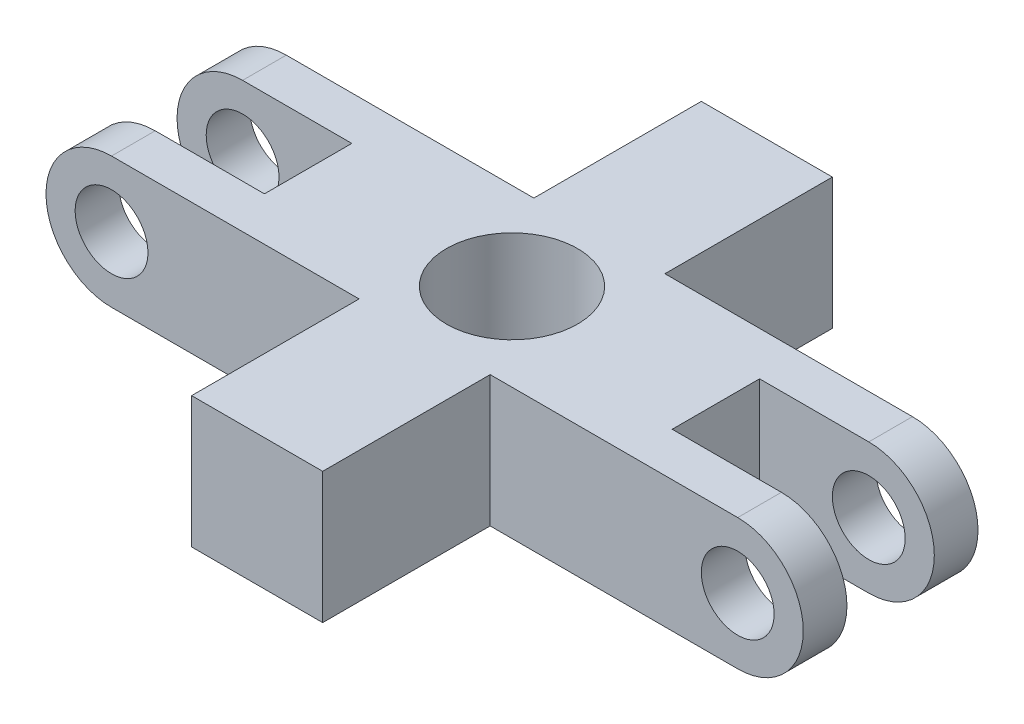
ISO-10303-21;
HEADER;
FILE_DESCRIPTION(('STEP AP214'),'2;1');
FILE_NAME('part.step','',(''),(''),'','','');
FILE_SCHEMA(('AUTOMOTIVE_DESIGN { 1 0 10303 214 1 1 1 1 }'));
ENDSEC;
DATA;
#1=APPLICATION_CONTEXT('core data for automotive mechanical design processes');
#2=APPLICATION_PROTOCOL_DEFINITION('international standard','automotive_design',2000,#1);
#3=PRODUCT_CONTEXT('',#1,'mechanical');
#4=PRODUCT('Part','Part','',(#3));
#5=PRODUCT_RELATED_PRODUCT_CATEGORY('part','',(#4));
#6=PRODUCT_DEFINITION_FORMATION('','',#4);
#7=PRODUCT_DEFINITION_CONTEXT('part definition',#1,'design');
#8=PRODUCT_DEFINITION('design','',#6,#7);
#9=PRODUCT_DEFINITION_SHAPE('','',#8);
#10=(LENGTH_UNIT() NAMED_UNIT(*) SI_UNIT(.MILLI.,.METRE.));
#11=(NAMED_UNIT(*) PLANE_ANGLE_UNIT() SI_UNIT($,.RADIAN.));
#12=(NAMED_UNIT(*) SI_UNIT($,.STERADIAN.) SOLID_ANGLE_UNIT());
#13=UNCERTAINTY_MEASURE_WITH_UNIT(LENGTH_MEASURE(1.E-05),#10,'distance_accuracy_value','');
#14=(GEOMETRIC_REPRESENTATION_CONTEXT(3) GLOBAL_UNCERTAINTY_ASSIGNED_CONTEXT((#13)) GLOBAL_UNIT_ASSIGNED_CONTEXT((#10,
#11,#12)) REPRESENTATION_CONTEXT('',''));
#15=CARTESIAN_POINT('',(0.,0.,0.));
#16=DIRECTION('',(0.,0.,1.));
#17=DIRECTION('',(1.,0.,0.));
#18=AXIS2_PLACEMENT_3D('',#15,#16,#17);
#19=CARTESIAN_POINT('',(21.5,0.,6.00000000000001));
#20=DIRECTION('',(0.,0.,-1.));
#21=DIRECTION('',(-1.,0.,0.));
#22=AXIS2_PLACEMENT_3D('',#19,#20,#21);
#23=CYLINDRICAL_SURFACE('',#22,4.5);
#24=DIRECTION('',(0.,0.,-1.));
#25=VECTOR('',#24,1.);
#26=CARTESIAN_POINT('',(21.5,4.5,0.));
#27=LINE('',#26,#25);
#28=CARTESIAN_POINT('',(21.5,4.5,6.00000000000001));
#29=VERTEX_POINT('',#28);
#30=CARTESIAN_POINT('',(21.5,4.5,3.));
#31=VERTEX_POINT('',#30);
#32=EDGE_CURVE('E189',#29,#31,#27,.T.);
#33=ORIENTED_EDGE('',*,*,#32,.F.);
#34=CARTESIAN_POINT('',(21.5,0.,6.00000000000001));
#35=DIRECTION('',(0.,0.,-1.));
#36=DIRECTION('',(-1.,0.,0.));
#37=AXIS2_PLACEMENT_3D('',#34,#35,#36);
#38=CIRCLE('',#37,4.5);
#39=CARTESIAN_POINT('',(21.5,-4.5,6.00000000000001));
#40=VERTEX_POINT('',#39);
#41=EDGE_CURVE('E54',#40,#29,#38,.F.);
#42=ORIENTED_EDGE('',*,*,#41,.F.);
#43=DIRECTION('',(0.,0.,1.));
#44=VECTOR('',#43,1.);
#45=CARTESIAN_POINT('',(21.5,-4.5,6.00000000000001));
#46=LINE('',#45,#44);
#47=CARTESIAN_POINT('',(21.5,-4.5,3.));
#48=VERTEX_POINT('',#47);
#49=EDGE_CURVE('E389',#48,#40,#46,.T.);
#50=ORIENTED_EDGE('',*,*,#49,.F.);
#51=CARTESIAN_POINT('',(21.5,0.,3.));
#52=DIRECTION('',(0.,0.,1.));
#53=DIRECTION('',(1.,0.,0.));
#54=AXIS2_PLACEMENT_3D('',#51,#52,#53);
#55=CIRCLE('',#54,4.5);
#56=EDGE_CURVE('E11',#31,#48,#55,.F.);
#57=ORIENTED_EDGE('',*,*,#56,.F.);
#58=EDGE_LOOP('',(#33,#42,#50,#57));
#59=FACE_BOUND('',#58,.T.);
#60=ADVANCED_FACE('F44',(#59),#23,.T.);
#61=CARTESIAN_POINT('',(21.5,0.,-3.));
#62=DIRECTION('',(0.,0.,-1.));
#63=DIRECTION('',(-1.,0.,0.));
#64=AXIS2_PLACEMENT_3D('',#61,#62,#63);
#65=CYLINDRICAL_SURFACE('',#64,4.5);
#66=DIRECTION('',(0.,0.,-1.));
#67=VECTOR('',#66,1.);
#68=CARTESIAN_POINT('',(21.5,4.5,0.));
#69=LINE('',#68,#67);
#70=CARTESIAN_POINT('',(21.5,4.5,-3.));
#71=VERTEX_POINT('',#70);
#72=CARTESIAN_POINT('',(21.5,4.5,-5.99999999999999));
#73=VERTEX_POINT('',#72);
#74=EDGE_CURVE('E373',#71,#73,#69,.T.);
#75=ORIENTED_EDGE('',*,*,#74,.F.);
#76=CARTESIAN_POINT('',(21.5,0.,-3.));
#77=DIRECTION('',(0.,0.,-1.));
#78=DIRECTION('',(-1.,0.,0.));
#79=AXIS2_PLACEMENT_3D('',#76,#77,#78);
#80=CIRCLE('',#79,4.5);
#81=CARTESIAN_POINT('',(21.5,-4.5,-3.));
#82=VERTEX_POINT('',#81);
#83=EDGE_CURVE('E381',#82,#71,#80,.F.);
#84=ORIENTED_EDGE('',*,*,#83,.F.);
#85=DIRECTION('',(0.,0.,1.));
#86=VECTOR('',#85,1.);
#87=CARTESIAN_POINT('',(21.5,-4.5,-3.));
#88=LINE('',#87,#86);
#89=CARTESIAN_POINT('',(21.5,-4.5,-5.99999999999999));
#90=VERTEX_POINT('',#89);
#91=EDGE_CURVE('E377',#90,#82,#88,.T.);
#92=ORIENTED_EDGE('',*,*,#91,.F.);
#93=CARTESIAN_POINT('',(21.5,0.,-5.99999999999999));
#94=DIRECTION('',(0.,0.,1.));
#95=DIRECTION('',(1.,0.,0.));
#96=AXIS2_PLACEMENT_3D('',#93,#94,#95);
#97=CIRCLE('',#96,4.5);
#98=EDGE_CURVE('E384',#73,#90,#97,.F.);
#99=ORIENTED_EDGE('',*,*,#98,.F.);
#100=EDGE_LOOP('',(#75,#84,#92,#99));
#101=FACE_BOUND('',#100,.T.);
#102=ADVANCED_FACE('F510',(#101),#65,.T.);
#103=CARTESIAN_POINT('',(-21.5,0.,-5.99999999999999));
#104=DIRECTION('',(0.,0.,1.));
#105=DIRECTION('',(1.,0.,0.));
#106=AXIS2_PLACEMENT_3D('',#103,#104,#105);
#107=CYLINDRICAL_SURFACE('',#106,4.5);
#108=DIRECTION('',(0.,0.,1.));
#109=VECTOR('',#108,1.);
#110=CARTESIAN_POINT('',(-21.5,4.5,0.));
#111=LINE('',#110,#109);
#112=CARTESIAN_POINT('',(-21.5,4.5,-5.99999999999999));
#113=VERTEX_POINT('',#112);
#114=CARTESIAN_POINT('',(-21.5,4.5,-3.));
#115=VERTEX_POINT('',#114);
#116=EDGE_CURVE('E359',#113,#115,#111,.T.);
#117=ORIENTED_EDGE('',*,*,#116,.F.);
#118=CARTESIAN_POINT('',(-21.5,0.,-5.99999999999999));
#119=DIRECTION('',(0.,0.,1.));
#120=DIRECTION('',(1.,0.,0.));
#121=AXIS2_PLACEMENT_3D('',#118,#119,#120);
#122=CIRCLE('',#121,4.5);
#123=CARTESIAN_POINT('',(-21.5,-4.5,-5.99999999999999));
#124=VERTEX_POINT('',#123);
#125=EDGE_CURVE('E367',#124,#113,#122,.F.);
#126=ORIENTED_EDGE('',*,*,#125,.F.);
#127=DIRECTION('',(0.,0.,-1.));
#128=VECTOR('',#127,1.);
#129=CARTESIAN_POINT('',(-21.5,-4.5,-5.99999999999999));
#130=LINE('',#129,#128);
#131=CARTESIAN_POINT('',(-21.5,-4.5,-3.));
#132=VERTEX_POINT('',#131);
#133=EDGE_CURVE('E363',#132,#124,#130,.T.);
#134=ORIENTED_EDGE('',*,*,#133,.F.);
#135=CARTESIAN_POINT('',(-21.5,0.,-3.));
#136=DIRECTION('',(0.,0.,-1.));
#137=DIRECTION('',(-1.,0.,0.));
#138=AXIS2_PLACEMENT_3D('',#135,#136,#137);
#139=CIRCLE('',#138,4.5);
#140=EDGE_CURVE('E370',#115,#132,#139,.F.);
#141=ORIENTED_EDGE('',*,*,#140,.F.);
#142=EDGE_LOOP('',(#117,#126,#134,#141));
#143=FACE_BOUND('',#142,.T.);
#144=ADVANCED_FACE('F508',(#143),#107,.T.);
#145=CARTESIAN_POINT('',(-21.5,0.,3.));
#146=DIRECTION('',(0.,0.,1.));
#147=DIRECTION('',(1.,0.,0.));
#148=AXIS2_PLACEMENT_3D('',#145,#146,#147);
#149=CYLINDRICAL_SURFACE('',#148,4.5);
#150=DIRECTION('',(0.,0.,1.));
#151=VECTOR('',#150,1.);
#152=CARTESIAN_POINT('',(-21.5,4.5,0.));
#153=LINE('',#152,#151);
#154=CARTESIAN_POINT('',(-21.5,4.5,3.));
#155=VERTEX_POINT('',#154);
#156=CARTESIAN_POINT('',(-21.5,4.5,6.));
#157=VERTEX_POINT('',#156);
#158=EDGE_CURVE('E201',#155,#157,#153,.T.);
#159=ORIENTED_EDGE('',*,*,#158,.F.);
#160=CARTESIAN_POINT('',(-21.5,0.,3.));
#161=DIRECTION('',(0.,0.,1.));
#162=DIRECTION('',(1.,0.,0.));
#163=AXIS2_PLACEMENT_3D('',#160,#161,#162);
#164=CIRCLE('',#163,4.5);
#165=CARTESIAN_POINT('',(-21.5,-4.5,3.));
#166=VERTEX_POINT('',#165);
#167=EDGE_CURVE('E353',#166,#155,#164,.F.);
#168=ORIENTED_EDGE('',*,*,#167,.F.);
#169=DIRECTION('',(0.,0.,-1.));
#170=VECTOR('',#169,1.);
#171=CARTESIAN_POINT('',(-21.5,-4.5,3.));
#172=LINE('',#171,#170);
#173=CARTESIAN_POINT('',(-21.5,-4.5,6.));
#174=VERTEX_POINT('',#173);
#175=EDGE_CURVE('E349',#174,#166,#172,.T.);
#176=ORIENTED_EDGE('',*,*,#175,.F.);
#177=CARTESIAN_POINT('',(-21.5,0.,6.));
#178=DIRECTION('',(0.,0.,-1.));
#179=DIRECTION('',(-1.,0.,0.));
#180=AXIS2_PLACEMENT_3D('',#177,#178,#179);
#181=CIRCLE('',#180,4.5);
#182=EDGE_CURVE('E356',#157,#174,#181,.F.);
#183=ORIENTED_EDGE('',*,*,#182,.F.);
#184=EDGE_LOOP('',(#159,#168,#176,#183));
#185=FACE_BOUND('',#184,.T.);
#186=ADVANCED_FACE('F490',(#185),#149,.T.);
#187=CARTESIAN_POINT('',(0.,4.5,0.));
#188=DIRECTION('',(0.,-1.,0.));
#189=DIRECTION('',(0.,0.,-1.));
#190=AXIS2_PLACEMENT_3D('',#187,#188,#189);
#191=PLANE('',#190);
#192=DIRECTION('',(1.,0.,0.));
#193=VECTOR('',#192,1.);
#194=CARTESIAN_POINT('',(4.50000000000001,4.5,6.));
#195=LINE('',#194,#193);
#196=CARTESIAN_POINT('',(4.50000000000001,4.5,6.));
#197=VERTEX_POINT('',#196);
#198=EDGE_CURVE('E191',#197,#29,#195,.T.);
#199=ORIENTED_EDGE('',*,*,#198,.T.);
#200=ORIENTED_EDGE('',*,*,#32,.T.);
#201=DIRECTION('',(-1.,0.,0.));
#202=VECTOR('',#201,1.);
#203=CARTESIAN_POINT('',(14.,4.5,3.));
#204=LINE('',#203,#202);
#205=CARTESIAN_POINT('',(14.,4.5,3.));
#206=VERTEX_POINT('',#205);
#207=EDGE_CURVE('E180',#31,#206,#204,.T.);
#208=ORIENTED_EDGE('',*,*,#207,.T.);
#209=DIRECTION('',(0.,0.,-1.));
#210=VECTOR('',#209,1.);
#211=CARTESIAN_POINT('',(14.,4.5,-3.));
#212=LINE('',#211,#210);
#213=CARTESIAN_POINT('',(14.,4.5,-3.));
#214=VERTEX_POINT('',#213);
#215=EDGE_CURVE('E187',#206,#214,#212,.T.);
#216=ORIENTED_EDGE('',*,*,#215,.T.);
#217=DIRECTION('',(1.,0.,0.));
#218=VECTOR('',#217,1.);
#219=CARTESIAN_POINT('',(26.,4.5,-3.));
#220=LINE('',#219,#218);
#221=EDGE_CURVE('E208',#214,#71,#220,.T.);
#222=ORIENTED_EDGE('',*,*,#221,.T.);
#223=ORIENTED_EDGE('',*,*,#74,.T.);
#224=DIRECTION('',(-1.,0.,0.));
#225=VECTOR('',#224,1.);
#226=CARTESIAN_POINT('',(4.5,4.5,-5.99999999999999));
#227=LINE('',#226,#225);
#228=CARTESIAN_POINT('',(4.5,4.5,-5.99999999999999));
#229=VERTEX_POINT('',#228);
#230=EDGE_CURVE('E211',#73,#229,#227,.T.);
#231=ORIENTED_EDGE('',*,*,#230,.T.);
#232=DIRECTION('',(0.,0.,-1.));
#233=VECTOR('',#232,1.);
#234=CARTESIAN_POINT('',(4.5,4.5,-17.5));
#235=LINE('',#234,#233);
#236=CARTESIAN_POINT('',(4.5,4.5,-17.5));
#237=VERTEX_POINT('',#236);
#238=EDGE_CURVE('E217',#229,#237,#235,.T.);
#239=ORIENTED_EDGE('',*,*,#238,.T.);
#240=DIRECTION('',(-1.,0.,0.));
#241=VECTOR('',#240,1.);
#242=CARTESIAN_POINT('',(-4.5,4.5,-17.5));
#243=LINE('',#242,#241);
#244=CARTESIAN_POINT('',(-4.5,4.5,-17.5));
#245=VERTEX_POINT('',#244);
#246=EDGE_CURVE('E220',#237,#245,#243,.T.);
#247=ORIENTED_EDGE('',*,*,#246,.T.);
#248=DIRECTION('',(0.,0.,1.));
#249=VECTOR('',#248,1.);
#250=CARTESIAN_POINT('',(-4.5,4.5,-17.5));
#251=LINE('',#250,#249);
#252=CARTESIAN_POINT('',(-4.5,4.5,-5.99999999999999));
#253=VERTEX_POINT('',#252);
#254=EDGE_CURVE('E223',#245,#253,#251,.T.);
#255=ORIENTED_EDGE('',*,*,#254,.T.);
#256=DIRECTION('',(-1.,0.,0.));
#257=VECTOR('',#256,1.);
#258=CARTESIAN_POINT('',(-26.,4.5,-5.99999999999999));
#259=LINE('',#258,#257);
#260=EDGE_CURVE('E226',#253,#113,#259,.T.);
#261=ORIENTED_EDGE('',*,*,#260,.T.);
#262=ORIENTED_EDGE('',*,*,#116,.T.);
#263=DIRECTION('',(1.,0.,0.));
#264=VECTOR('',#263,1.);
#265=CARTESIAN_POINT('',(-26.,4.5,-3.));
#266=LINE('',#265,#264);
#267=CARTESIAN_POINT('',(-14.,4.5,-3.));
#268=VERTEX_POINT('',#267);
#269=EDGE_CURVE('E230',#115,#268,#266,.T.);
#270=ORIENTED_EDGE('',*,*,#269,.T.);
#271=DIRECTION('',(0.,0.,1.));
#272=VECTOR('',#271,1.);
#273=CARTESIAN_POINT('',(-14.,4.5,-3.));
#274=LINE('',#273,#272);
#275=CARTESIAN_POINT('',(-14.,4.5,3.));
#276=VERTEX_POINT('',#275);
#277=EDGE_CURVE('E233',#268,#276,#274,.T.);
#278=ORIENTED_EDGE('',*,*,#277,.T.);
#279=DIRECTION('',(-1.,0.,0.));
#280=VECTOR('',#279,1.);
#281=CARTESIAN_POINT('',(-14.,4.5,3.));
#282=LINE('',#281,#280);
#283=EDGE_CURVE('E236',#276,#155,#282,.T.);
#284=ORIENTED_EDGE('',*,*,#283,.T.);
#285=ORIENTED_EDGE('',*,*,#158,.T.);
#286=DIRECTION('',(1.,0.,0.));
#287=VECTOR('',#286,1.);
#288=CARTESIAN_POINT('',(-26.,4.5,6.));
#289=LINE('',#288,#287);
#290=CARTESIAN_POINT('',(-4.5,4.5,6.));
#291=VERTEX_POINT('',#290);
#292=EDGE_CURVE('E240',#157,#291,#289,.T.);
#293=ORIENTED_EDGE('',*,*,#292,.T.);
#294=DIRECTION('',(0.,0.,1.));
#295=VECTOR('',#294,1.);
#296=CARTESIAN_POINT('',(-4.5,4.5,6.));
#297=LINE('',#296,#295);
#298=CARTESIAN_POINT('',(-4.5,4.5,17.5));
#299=VERTEX_POINT('',#298);
#300=EDGE_CURVE('E243',#291,#299,#297,.T.);
#301=ORIENTED_EDGE('',*,*,#300,.T.);
#302=DIRECTION('',(1.,0.,0.));
#303=VECTOR('',#302,1.);
#304=CARTESIAN_POINT('',(-4.5,4.5,17.5));
#305=LINE('',#304,#303);
#306=CARTESIAN_POINT('',(4.5,4.5,17.5));
#307=VERTEX_POINT('',#306);
#308=EDGE_CURVE('E246',#299,#307,#305,.T.);
#309=ORIENTED_EDGE('',*,*,#308,.T.);
#310=DIRECTION('',(0.,0.,-1.));
#311=VECTOR('',#310,1.);
#312=CARTESIAN_POINT('',(4.50000000000001,4.5,6.));
#313=LINE('',#312,#311);
#314=EDGE_CURVE('E249',#307,#197,#313,.T.);
#315=ORIENTED_EDGE('',*,*,#314,.T.);
#316=EDGE_LOOP('',(#199,#200,#208,#216,#222,#223,#231,#239,#247,#255,#261,#262,#270,#278,#284,
#285,#293,#301,#309,#315));
#317=FACE_BOUND('',#316,.T.);
#318=CARTESIAN_POINT('',(0.,4.5,0.));
#319=DIRECTION('',(0.,1.,0.));
#320=DIRECTION('',(0.,0.,1.));
#321=AXIS2_PLACEMENT_3D('',#318,#319,#320);
#322=CIRCLE('',#321,4.5);
#323=CARTESIAN_POINT('',(0.,4.5,4.5));
#324=VERTEX_POINT('',#323);
#325=EDGE_CURVE('E257',#324,#324,#322,.T.);
#326=ORIENTED_EDGE('',*,*,#325,.F.);
#327=EDGE_LOOP('',(#326));
#328=FACE_BOUND('',#327,.T.);
#329=ADVANCED_FACE('F183',(#317,#328),#191,.F.);
#330=CARTESIAN_POINT('',(0.,-4.5,0.));
#331=DIRECTION('',(0.,-1.,0.));
#332=DIRECTION('',(0.,0.,-1.));
#333=AXIS2_PLACEMENT_3D('',#330,#331,#332);
#334=PLANE('',#333);
#335=DIRECTION('',(-1.,0.,0.));
#336=VECTOR('',#335,1.);
#337=CARTESIAN_POINT('',(14.,-4.5,3.));
#338=LINE('',#337,#336);
#339=CARTESIAN_POINT('',(14.,-4.5,3.));
#340=VERTEX_POINT('',#339);
#341=EDGE_CURVE('E197',#48,#340,#338,.T.);
#342=ORIENTED_EDGE('',*,*,#341,.F.);
#343=ORIENTED_EDGE('',*,*,#49,.T.);
#344=DIRECTION('',(1.,0.,0.));
#345=VECTOR('',#344,1.);
#346=CARTESIAN_POINT('',(4.50000000000001,-4.5,6.));
#347=LINE('',#346,#345);
#348=CARTESIAN_POINT('',(4.50000000000001,-4.5,6.));
#349=VERTEX_POINT('',#348);
#350=EDGE_CURVE('E253',#349,#40,#347,.T.);
#351=ORIENTED_EDGE('',*,*,#350,.F.);
#352=DIRECTION('',(0.,0.,-1.));
#353=VECTOR('',#352,1.);
#354=CARTESIAN_POINT('',(4.50000000000001,-4.5,6.));
#355=LINE('',#354,#353);
#356=CARTESIAN_POINT('',(4.5,-4.5,17.5));
#357=VERTEX_POINT('',#356);
#358=EDGE_CURVE('E302',#357,#349,#355,.T.);
#359=ORIENTED_EDGE('',*,*,#358,.F.);
#360=DIRECTION('',(1.,0.,0.));
#361=VECTOR('',#360,1.);
#362=CARTESIAN_POINT('',(-4.5,-4.5,17.5));
#363=LINE('',#362,#361);
#364=CARTESIAN_POINT('',(-4.5,-4.5,17.5));
#365=VERTEX_POINT('',#364);
#366=EDGE_CURVE('E299',#365,#357,#363,.T.);
#367=ORIENTED_EDGE('',*,*,#366,.F.);
#368=DIRECTION('',(0.,0.,1.));
#369=VECTOR('',#368,1.);
#370=CARTESIAN_POINT('',(-4.5,-4.5,6.));
#371=LINE('',#370,#369);
#372=CARTESIAN_POINT('',(-4.5,-4.5,6.));
#373=VERTEX_POINT('',#372);
#374=EDGE_CURVE('E296',#373,#365,#371,.T.);
#375=ORIENTED_EDGE('',*,*,#374,.F.);
#376=DIRECTION('',(1.,0.,0.));
#377=VECTOR('',#376,1.);
#378=CARTESIAN_POINT('',(-26.,-4.5,6.));
#379=LINE('',#378,#377);
#380=EDGE_CURVE('E293',#174,#373,#379,.T.);
#381=ORIENTED_EDGE('',*,*,#380,.F.);
#382=ORIENTED_EDGE('',*,*,#175,.T.);
#383=DIRECTION('',(-1.,0.,0.));
#384=VECTOR('',#383,1.);
#385=CARTESIAN_POINT('',(-14.,-4.5,3.));
#386=LINE('',#385,#384);
#387=CARTESIAN_POINT('',(-14.,-4.5,3.));
#388=VERTEX_POINT('',#387);
#389=EDGE_CURVE('E289',#388,#166,#386,.T.);
#390=ORIENTED_EDGE('',*,*,#389,.F.);
#391=DIRECTION('',(0.,0.,1.));
#392=VECTOR('',#391,1.);
#393=CARTESIAN_POINT('',(-14.,-4.5,-3.));
#394=LINE('',#393,#392);
#395=CARTESIAN_POINT('',(-14.,-4.5,-3.));
#396=VERTEX_POINT('',#395);
#397=EDGE_CURVE('E286',#396,#388,#394,.T.);
#398=ORIENTED_EDGE('',*,*,#397,.F.);
#399=DIRECTION('',(1.,0.,0.));
#400=VECTOR('',#399,1.);
#401=CARTESIAN_POINT('',(-26.,-4.5,-3.));
#402=LINE('',#401,#400);
#403=EDGE_CURVE('E283',#132,#396,#402,.T.);
#404=ORIENTED_EDGE('',*,*,#403,.F.);
#405=ORIENTED_EDGE('',*,*,#133,.T.);
#406=DIRECTION('',(-1.,0.,0.));
#407=VECTOR('',#406,1.);
#408=CARTESIAN_POINT('',(-26.,-4.5,-5.99999999999999));
#409=LINE('',#408,#407);
#410=CARTESIAN_POINT('',(-4.5,-4.5,-5.99999999999999));
#411=VERTEX_POINT('',#410);
#412=EDGE_CURVE('E279',#411,#124,#409,.T.);
#413=ORIENTED_EDGE('',*,*,#412,.F.);
#414=DIRECTION('',(0.,0.,1.));
#415=VECTOR('',#414,1.);
#416=CARTESIAN_POINT('',(-4.5,-4.5,-17.5));
#417=LINE('',#416,#415);
#418=CARTESIAN_POINT('',(-4.5,-4.5,-17.5));
#419=VERTEX_POINT('',#418);
#420=EDGE_CURVE('E276',#419,#411,#417,.T.);
#421=ORIENTED_EDGE('',*,*,#420,.F.);
#422=DIRECTION('',(-1.,0.,0.));
#423=VECTOR('',#422,1.);
#424=CARTESIAN_POINT('',(-4.5,-4.5,-17.5));
#425=LINE('',#424,#423);
#426=CARTESIAN_POINT('',(4.5,-4.5,-17.5));
#427=VERTEX_POINT('',#426);
#428=EDGE_CURVE('E273',#427,#419,#425,.T.);
#429=ORIENTED_EDGE('',*,*,#428,.F.);
#430=DIRECTION('',(0.,0.,-1.));
#431=VECTOR('',#430,1.);
#432=CARTESIAN_POINT('',(4.5,-4.5,-17.5));
#433=LINE('',#432,#431);
#434=CARTESIAN_POINT('',(4.5,-4.5,-5.99999999999999));
#435=VERTEX_POINT('',#434);
#436=EDGE_CURVE('E270',#435,#427,#433,.T.);
#437=ORIENTED_EDGE('',*,*,#436,.F.);
#438=DIRECTION('',(-1.,0.,0.));
#439=VECTOR('',#438,1.);
#440=CARTESIAN_POINT('',(4.5,-4.5,-5.99999999999999));
#441=LINE('',#440,#439);
#442=EDGE_CURVE('E267',#90,#435,#441,.T.);
#443=ORIENTED_EDGE('',*,*,#442,.F.);
#444=ORIENTED_EDGE('',*,*,#91,.T.);
#445=DIRECTION('',(1.,0.,0.));
#446=VECTOR('',#445,1.);
#447=CARTESIAN_POINT('',(26.,-4.5,-3.));
#448=LINE('',#447,#446);
#449=CARTESIAN_POINT('',(14.,-4.5,-3.));
#450=VERTEX_POINT('',#449);
#451=EDGE_CURVE('E263',#450,#82,#448,.T.);
#452=ORIENTED_EDGE('',*,*,#451,.F.);
#453=DIRECTION('',(0.,0.,-1.));
#454=VECTOR('',#453,1.);
#455=CARTESIAN_POINT('',(14.,-4.5,-3.));
#456=LINE('',#455,#454);
#457=EDGE_CURVE('E260',#340,#450,#456,.T.);
#458=ORIENTED_EDGE('',*,*,#457,.F.);
#459=EDGE_LOOP('',(#342,#343,#351,#359,#367,#375,#381,#382,#390,#398,#404,#405,#413,#421,#429,
#437,#443,#444,#452,#458));
#460=FACE_BOUND('',#459,.T.);
#461=CARTESIAN_POINT('',(0.,-4.5,0.));
#462=DIRECTION('',(0.,1.,0.));
#463=DIRECTION('',(0.,0.,1.));
#464=AXIS2_PLACEMENT_3D('',#461,#462,#463);
#465=CIRCLE('',#464,4.5);
#466=CARTESIAN_POINT('',(0.,-4.5,4.5));
#467=VERTEX_POINT('',#466);
#468=EDGE_CURVE('E423',#467,#467,#465,.T.);
#469=ORIENTED_EDGE('',*,*,#468,.T.);
#470=EDGE_LOOP('',(#469));
#471=FACE_BOUND('',#470,.T.);
#472=ADVANCED_FACE('F437',(#460,#471),#334,.T.);
#473=CARTESIAN_POINT('',(4.50000000000001,4.5,6.));
#474=DIRECTION('',(0.,0.,-1.));
#475=DIRECTION('',(-1.,0.,0.));
#476=AXIS2_PLACEMENT_3D('',#473,#474,#475);
#477=PLANE('',#476);
#478=CARTESIAN_POINT('',(21.5,0.,6.00000000000001));
#479=DIRECTION('',(0.,0.,-1.));
#480=DIRECTION('',(-1.,0.,0.));
#481=AXIS2_PLACEMENT_3D('',#478,#479,#480);
#482=CIRCLE('',#481,2.5);
#483=CARTESIAN_POINT('',(19.,0.,6.00000000000001));
#484=VERTEX_POINT('',#483);
#485=EDGE_CURVE('E397',#484,#484,#482,.T.);
#486=ORIENTED_EDGE('',*,*,#485,.T.);
#487=EDGE_LOOP('',(#486));
#488=FACE_BOUND('',#487,.T.);
#489=ORIENTED_EDGE('',*,*,#350,.T.);
#490=ORIENTED_EDGE('',*,*,#41,.T.);
#491=ORIENTED_EDGE('',*,*,#198,.F.);
#492=DIRECTION('',(0.,-1.,0.));
#493=VECTOR('',#492,1.);
#494=CARTESIAN_POINT('',(4.50000000000001,4.5,6.));
#495=LINE('',#494,#493);
#496=EDGE_CURVE('E252',#197,#349,#495,.T.);
#497=ORIENTED_EDGE('',*,*,#496,.T.);
#498=EDGE_LOOP('',(#489,#490,#491,#497));
#499=FACE_BOUND('',#498,.T.);
#500=ADVANCED_FACE('F434',(#488,#499),#477,.F.);
#501=CARTESIAN_POINT('',(14.,4.5,3.));
#502=DIRECTION('',(0.,0.,1.));
#503=DIRECTION('',(1.,0.,0.));
#504=AXIS2_PLACEMENT_3D('',#501,#502,#503);
#505=PLANE('',#504);
#506=CARTESIAN_POINT('',(21.5,0.,3.));
#507=DIRECTION('',(0.,0.,1.));
#508=DIRECTION('',(1.,0.,0.));
#509=AXIS2_PLACEMENT_3D('',#506,#507,#508);
#510=CIRCLE('',#509,2.5);
#511=CARTESIAN_POINT('',(24.,0.,3.));
#512=VERTEX_POINT('',#511);
#513=EDGE_CURVE('E406',#512,#512,#510,.T.);
#514=ORIENTED_EDGE('',*,*,#513,.T.);
#515=EDGE_LOOP('',(#514));
#516=FACE_BOUND('',#515,.T.);
#517=ORIENTED_EDGE('',*,*,#207,.F.);
#518=ORIENTED_EDGE('',*,*,#56,.T.);
#519=ORIENTED_EDGE('',*,*,#341,.T.);
#520=DIRECTION('',(0.,-1.,0.));
#521=VECTOR('',#520,1.);
#522=CARTESIAN_POINT('',(14.,4.5,3.));
#523=LINE('',#522,#521);
#524=EDGE_CURVE('E194',#206,#340,#523,.T.);
#525=ORIENTED_EDGE('',*,*,#524,.F.);
#526=EDGE_LOOP('',(#517,#518,#519,#525));
#527=FACE_BOUND('',#526,.T.);
#528=ADVANCED_FACE('F195',(#516,#527),#505,.F.);
#529=CARTESIAN_POINT('',(14.,4.5,-3.));
#530=DIRECTION('',(-1.,0.,0.));
#531=DIRECTION('',(0.,0.,1.));
#532=AXIS2_PLACEMENT_3D('',#529,#530,#531);
#533=PLANE('',#532);
#534=ORIENTED_EDGE('',*,*,#457,.T.);
#535=DIRECTION('',(0.,-1.,0.));
#536=VECTOR('',#535,1.);
#537=CARTESIAN_POINT('',(14.,4.5,-3.));
#538=LINE('',#537,#536);
#539=EDGE_CURVE('E202',#214,#450,#538,.T.);
#540=ORIENTED_EDGE('',*,*,#539,.F.);
#541=ORIENTED_EDGE('',*,*,#215,.F.);
#542=ORIENTED_EDGE('',*,*,#524,.T.);
#543=EDGE_LOOP('',(#534,#540,#541,#542));
#544=FACE_BOUND('',#543,.T.);
#545=ADVANCED_FACE('F204',(#544),#533,.F.);
#546=CARTESIAN_POINT('',(26.,4.5,-3.));
#547=DIRECTION('',(0.,0.,-1.));
#548=DIRECTION('',(-1.,0.,0.));
#549=AXIS2_PLACEMENT_3D('',#546,#547,#548);
#550=PLANE('',#549);
#551=CARTESIAN_POINT('',(21.5,0.,-3.));
#552=DIRECTION('',(0.,0.,-1.));
#553=DIRECTION('',(-1.,0.,0.));
#554=AXIS2_PLACEMENT_3D('',#551,#552,#553);
#555=CIRCLE('',#554,2.5);
#556=CARTESIAN_POINT('',(19.,0.,-3.));
#557=VERTEX_POINT('',#556);
#558=EDGE_CURVE('E412',#557,#557,#555,.T.);
#559=ORIENTED_EDGE('',*,*,#558,.T.);
#560=EDGE_LOOP('',(#559));
#561=FACE_BOUND('',#560,.T.);
#562=ORIENTED_EDGE('',*,*,#451,.T.);
#563=ORIENTED_EDGE('',*,*,#83,.T.);
#564=ORIENTED_EDGE('',*,*,#221,.F.);
#565=ORIENTED_EDGE('',*,*,#539,.T.);
#566=EDGE_LOOP('',(#562,#563,#564,#565));
#567=FACE_BOUND('',#566,.T.);
#568=ADVANCED_FACE('F441',(#561,#567),#550,.F.);
#569=CARTESIAN_POINT('',(4.5,4.5,-5.99999999999999));
#570=DIRECTION('',(0.,0.,1.));
#571=DIRECTION('',(1.,0.,0.));
#572=AXIS2_PLACEMENT_3D('',#569,#570,#571);
#573=PLANE('',#572);
#574=CARTESIAN_POINT('',(21.5,0.,-5.99999999999999));
#575=DIRECTION('',(0.,0.,1.));
#576=DIRECTION('',(1.,0.,0.));
#577=AXIS2_PLACEMENT_3D('',#574,#575,#576);
#578=CIRCLE('',#577,2.5);
#579=CARTESIAN_POINT('',(24.,0.,-5.99999999999999));
#580=VERTEX_POINT('',#579);
#581=EDGE_CURVE('E48',#580,#580,#578,.T.);
#582=ORIENTED_EDGE('',*,*,#581,.T.);
#583=EDGE_LOOP('',(#582));
#584=FACE_BOUND('',#583,.T.);
#585=ORIENTED_EDGE('',*,*,#230,.F.);
#586=ORIENTED_EDGE('',*,*,#98,.T.);
#587=ORIENTED_EDGE('',*,*,#442,.T.);
#588=DIRECTION('',(0.,-1.,0.));
#589=VECTOR('',#588,1.);
#590=CARTESIAN_POINT('',(4.5,4.5,-5.99999999999999));
#591=LINE('',#590,#589);
#592=EDGE_CURVE('E340',#229,#435,#591,.T.);
#593=ORIENTED_EDGE('',*,*,#592,.F.);
#594=EDGE_LOOP('',(#585,#586,#587,#593));
#595=FACE_BOUND('',#594,.T.);
#596=ADVANCED_FACE('F447',(#584,#595),#573,.F.);
#597=CARTESIAN_POINT('',(4.5,4.5,-17.5));
#598=DIRECTION('',(-1.,0.,0.));
#599=DIRECTION('',(0.,0.,1.));
#600=AXIS2_PLACEMENT_3D('',#597,#598,#599);
#601=PLANE('',#600);
#602=ORIENTED_EDGE('',*,*,#436,.T.);
#603=DIRECTION('',(0.,-1.,0.));
#604=VECTOR('',#603,1.);
#605=CARTESIAN_POINT('',(4.5,4.5,-17.5));
#606=LINE('',#605,#604);
#607=EDGE_CURVE('E336',#237,#427,#606,.T.);
#608=ORIENTED_EDGE('',*,*,#607,.F.);
#609=ORIENTED_EDGE('',*,*,#238,.F.);
#610=ORIENTED_EDGE('',*,*,#592,.T.);
#611=EDGE_LOOP('',(#602,#608,#609,#610));
#612=FACE_BOUND('',#611,.T.);
#613=ADVANCED_FACE('F454',(#612),#601,.F.);
#614=CARTESIAN_POINT('',(-4.5,4.5,-17.5));
#615=DIRECTION('',(0.,0.,1.));
#616=DIRECTION('',(1.,0.,0.));
#617=AXIS2_PLACEMENT_3D('',#614,#615,#616);
#618=PLANE('',#617);
#619=ORIENTED_EDGE('',*,*,#428,.T.);
#620=DIRECTION('',(0.,-1.,0.));
#621=VECTOR('',#620,1.);
#622=CARTESIAN_POINT('',(-4.5,4.5,-17.5));
#623=LINE('',#622,#621);
#624=EDGE_CURVE('E332',#245,#419,#623,.T.);
#625=ORIENTED_EDGE('',*,*,#624,.F.);
#626=ORIENTED_EDGE('',*,*,#246,.F.);
#627=ORIENTED_EDGE('',*,*,#607,.T.);
#628=EDGE_LOOP('',(#619,#625,#626,#627));
#629=FACE_BOUND('',#628,.T.);
#630=ADVANCED_FACE('F460',(#629),#618,.F.);
#631=CARTESIAN_POINT('',(-4.5,4.5,-17.5));
#632=DIRECTION('',(1.,0.,0.));
#633=DIRECTION('',(0.,0.,-1.));
#634=AXIS2_PLACEMENT_3D('',#631,#632,#633);
#635=PLANE('',#634);
#636=ORIENTED_EDGE('',*,*,#420,.T.);
#637=DIRECTION('',(0.,-1.,0.));
#638=VECTOR('',#637,1.);
#639=CARTESIAN_POINT('',(-4.5,4.5,-5.99999999999999));
#640=LINE('',#639,#638);
#641=EDGE_CURVE('E328',#253,#411,#640,.T.);
#642=ORIENTED_EDGE('',*,*,#641,.F.);
#643=ORIENTED_EDGE('',*,*,#254,.F.);
#644=ORIENTED_EDGE('',*,*,#624,.T.);
#645=EDGE_LOOP('',(#636,#642,#643,#644));
#646=FACE_BOUND('',#645,.T.);
#647=ADVANCED_FACE('F464',(#646),#635,.F.);
#648=CARTESIAN_POINT('',(-26.,4.5,-5.99999999999999));
#649=DIRECTION('',(0.,0.,1.));
#650=DIRECTION('',(1.,0.,0.));
#651=AXIS2_PLACEMENT_3D('',#648,#649,#650);
#652=PLANE('',#651);
#653=CARTESIAN_POINT('',(-21.5,0.,-5.99999999999999));
#654=DIRECTION('',(0.,0.,1.));
#655=DIRECTION('',(1.,0.,0.));
#656=AXIS2_PLACEMENT_3D('',#653,#654,#655);
#657=CIRCLE('',#656,2.5);
#658=CARTESIAN_POINT('',(-19.,0.,-5.99999999999999));
#659=VERTEX_POINT('',#658);
#660=EDGE_CURVE('E419',#659,#659,#657,.F.);
#661=ORIENTED_EDGE('',*,*,#660,.F.);
#662=EDGE_LOOP('',(#661));
#663=FACE_BOUND('',#662,.T.);
#664=ORIENTED_EDGE('',*,*,#412,.T.);
#665=ORIENTED_EDGE('',*,*,#125,.T.);
#666=ORIENTED_EDGE('',*,*,#260,.F.);
#667=ORIENTED_EDGE('',*,*,#641,.T.);
#668=EDGE_LOOP('',(#664,#665,#666,#667));
#669=FACE_BOUND('',#668,.T.);
#670=ADVANCED_FACE('F468',(#663,#669),#652,.F.);
#671=CARTESIAN_POINT('',(-26.,4.5,-3.));
#672=DIRECTION('',(0.,0.,-1.));
#673=DIRECTION('',(-1.,0.,0.));
#674=AXIS2_PLACEMENT_3D('',#671,#672,#673);
#675=PLANE('',#674);
#676=CARTESIAN_POINT('',(-21.5,0.,-3.));
#677=DIRECTION('',(0.,0.,-1.));
#678=DIRECTION('',(-1.,0.,0.));
#679=AXIS2_PLACEMENT_3D('',#676,#677,#678);
#680=CIRCLE('',#679,2.5);
#681=CARTESIAN_POINT('',(-24.,0.,-3.));
#682=VERTEX_POINT('',#681);
#683=EDGE_CURVE('E403',#682,#682,#680,.F.);
#684=ORIENTED_EDGE('',*,*,#683,.F.);
#685=EDGE_LOOP('',(#684));
#686=FACE_BOUND('',#685,.T.);
#687=ORIENTED_EDGE('',*,*,#269,.F.);
#688=ORIENTED_EDGE('',*,*,#140,.T.);
#689=ORIENTED_EDGE('',*,*,#403,.T.);
#690=DIRECTION('',(0.,-1.,0.));
#691=VECTOR('',#690,1.);
#692=CARTESIAN_POINT('',(-14.,4.5,-3.));
#693=LINE('',#692,#691);
#694=EDGE_CURVE('E324',#268,#396,#693,.T.);
#695=ORIENTED_EDGE('',*,*,#694,.F.);
#696=EDGE_LOOP('',(#687,#688,#689,#695));
#697=FACE_BOUND('',#696,.T.);
#698=ADVANCED_FACE('F474',(#686,#697),#675,.F.);
#699=CARTESIAN_POINT('',(-14.,4.5,-3.));
#700=DIRECTION('',(1.,0.,0.));
#701=DIRECTION('',(0.,0.,-1.));
#702=AXIS2_PLACEMENT_3D('',#699,#700,#701);
#703=PLANE('',#702);
#704=ORIENTED_EDGE('',*,*,#397,.T.);
#705=DIRECTION('',(0.,-1.,0.));
#706=VECTOR('',#705,1.);
#707=CARTESIAN_POINT('',(-14.,4.5,3.));
#708=LINE('',#707,#706);
#709=EDGE_CURVE('E320',#276,#388,#708,.T.);
#710=ORIENTED_EDGE('',*,*,#709,.F.);
#711=ORIENTED_EDGE('',*,*,#277,.F.);
#712=ORIENTED_EDGE('',*,*,#694,.T.);
#713=EDGE_LOOP('',(#704,#710,#711,#712));
#714=FACE_BOUND('',#713,.T.);
#715=ADVANCED_FACE('F481',(#714),#703,.F.);
#716=CARTESIAN_POINT('',(-14.,4.5,3.));
#717=DIRECTION('',(0.,0.,1.));
#718=DIRECTION('',(1.,0.,0.));
#719=AXIS2_PLACEMENT_3D('',#716,#717,#718);
#720=PLANE('',#719);
#721=CARTESIAN_POINT('',(-21.5,0.,3.));
#722=DIRECTION('',(0.,0.,1.));
#723=DIRECTION('',(1.,0.,0.));
#724=AXIS2_PLACEMENT_3D('',#721,#722,#723);
#725=CIRCLE('',#724,2.5);
#726=CARTESIAN_POINT('',(-19.,0.,3.));
#727=VERTEX_POINT('',#726);
#728=EDGE_CURVE('E396',#727,#727,#725,.F.);
#729=ORIENTED_EDGE('',*,*,#728,.F.);
#730=EDGE_LOOP('',(#729));
#731=FACE_BOUND('',#730,.T.);
#732=ORIENTED_EDGE('',*,*,#389,.T.);
#733=ORIENTED_EDGE('',*,*,#167,.T.);
#734=ORIENTED_EDGE('',*,*,#283,.F.);
#735=ORIENTED_EDGE('',*,*,#709,.T.);
#736=EDGE_LOOP('',(#732,#733,#734,#735));
#737=FACE_BOUND('',#736,.T.);
#738=ADVANCED_FACE('F486',(#731,#737),#720,.F.);
#739=CARTESIAN_POINT('',(-26.,4.5,6.));
#740=DIRECTION('',(0.,0.,-1.));
#741=DIRECTION('',(-1.,0.,0.));
#742=AXIS2_PLACEMENT_3D('',#739,#740,#741);
#743=PLANE('',#742);
#744=CARTESIAN_POINT('',(-21.5,0.,6.00000000000001));
#745=DIRECTION('',(0.,0.,-1.));
#746=DIRECTION('',(-1.,0.,0.));
#747=AXIS2_PLACEMENT_3D('',#744,#745,#746);
#748=CIRCLE('',#747,2.5);
#749=CARTESIAN_POINT('',(-24.,0.,6.00000000000001));
#750=VERTEX_POINT('',#749);
#751=EDGE_CURVE('E393',#750,#750,#748,.F.);
#752=ORIENTED_EDGE('',*,*,#751,.F.);
#753=EDGE_LOOP('',(#752));
#754=FACE_BOUND('',#753,.T.);
#755=ORIENTED_EDGE('',*,*,#292,.F.);
#756=ORIENTED_EDGE('',*,*,#182,.T.);
#757=ORIENTED_EDGE('',*,*,#380,.T.);
#758=DIRECTION('',(0.,-1.,0.));
#759=VECTOR('',#758,1.);
#760=CARTESIAN_POINT('',(-4.5,4.5,6.));
#761=LINE('',#760,#759);
#762=EDGE_CURVE('E316',#291,#373,#761,.T.);
#763=ORIENTED_EDGE('',*,*,#762,.F.);
#764=EDGE_LOOP('',(#755,#756,#757,#763));
#765=FACE_BOUND('',#764,.T.);
#766=ADVANCED_FACE('F493',(#754,#765),#743,.F.);
#767=CARTESIAN_POINT('',(-4.5,4.5,6.));
#768=DIRECTION('',(1.,0.,0.));
#769=DIRECTION('',(0.,0.,-1.));
#770=AXIS2_PLACEMENT_3D('',#767,#768,#769);
#771=PLANE('',#770);
#772=ORIENTED_EDGE('',*,*,#374,.T.);
#773=DIRECTION('',(0.,-1.,0.));
#774=VECTOR('',#773,1.);
#775=CARTESIAN_POINT('',(-4.5,4.5,17.5));
#776=LINE('',#775,#774);
#777=EDGE_CURVE('E312',#299,#365,#776,.T.);
#778=ORIENTED_EDGE('',*,*,#777,.F.);
#779=ORIENTED_EDGE('',*,*,#300,.F.);
#780=ORIENTED_EDGE('',*,*,#762,.T.);
#781=EDGE_LOOP('',(#772,#778,#779,#780));
#782=FACE_BOUND('',#781,.T.);
#783=ADVANCED_FACE('F500',(#782),#771,.F.);
#784=CARTESIAN_POINT('',(-4.5,4.5,17.5));
#785=DIRECTION('',(0.,0.,-1.));
#786=DIRECTION('',(-1.,0.,0.));
#787=AXIS2_PLACEMENT_3D('',#784,#785,#786);
#788=PLANE('',#787);
#789=ORIENTED_EDGE('',*,*,#366,.T.);
#790=DIRECTION('',(0.,-1.,0.));
#791=VECTOR('',#790,1.);
#792=CARTESIAN_POINT('',(4.5,4.5,17.5));
#793=LINE('',#792,#791);
#794=EDGE_CURVE('E308',#307,#357,#793,.T.);
#795=ORIENTED_EDGE('',*,*,#794,.F.);
#796=ORIENTED_EDGE('',*,*,#308,.F.);
#797=ORIENTED_EDGE('',*,*,#777,.T.);
#798=EDGE_LOOP('',(#789,#795,#796,#797));
#799=FACE_BOUND('',#798,.T.);
#800=ADVANCED_FACE('F504',(#799),#788,.F.);
#801=CARTESIAN_POINT('',(4.50000000000001,4.5,6.));
#802=DIRECTION('',(-1.,0.,0.));
#803=DIRECTION('',(0.,0.,1.));
#804=AXIS2_PLACEMENT_3D('',#801,#802,#803);
#805=PLANE('',#804);
#806=ORIENTED_EDGE('',*,*,#358,.T.);
#807=ORIENTED_EDGE('',*,*,#496,.F.);
#808=ORIENTED_EDGE('',*,*,#314,.F.);
#809=ORIENTED_EDGE('',*,*,#794,.T.);
#810=EDGE_LOOP('',(#806,#807,#808,#809));
#811=FACE_BOUND('',#810,.T.);
#812=ADVANCED_FACE('F507',(#811),#805,.F.);
#813=CARTESIAN_POINT('',(0.,4.5,0.));
#814=DIRECTION('',(0.,-1.,0.));
#815=DIRECTION('',(0.,0.,-1.));
#816=AXIS2_PLACEMENT_3D('',#813,#814,#815);
#817=CYLINDRICAL_SURFACE('',#816,4.5);
#818=ORIENTED_EDGE('',*,*,#325,.T.);
#819=EDGE_LOOP('',(#818));
#820=FACE_BOUND('',#819,.T.);
#821=ORIENTED_EDGE('',*,*,#468,.F.);
#822=EDGE_LOOP('',(#821));
#823=FACE_BOUND('',#822,.T.);
#824=ADVANCED_FACE('F543',(#820,#823),#817,.F.);
#825=CARTESIAN_POINT('',(-21.5,0.,17.5));
#826=DIRECTION('',(0.,0.,-1.));
#827=DIRECTION('',(-1.,0.,0.));
#828=AXIS2_PLACEMENT_3D('',#825,#826,#827);
#829=CYLINDRICAL_SURFACE('',#828,2.5);
#830=ORIENTED_EDGE('',*,*,#751,.T.);
#831=EDGE_LOOP('',(#830));
#832=FACE_BOUND('',#831,.T.);
#833=ORIENTED_EDGE('',*,*,#728,.T.);
#834=EDGE_LOOP('',(#833));
#835=FACE_BOUND('',#834,.T.);
#836=ADVANCED_FACE('F547',(#832,#835),#829,.F.);
#837=ORIENTED_EDGE('',*,*,#683,.T.);
#838=EDGE_LOOP('',(#837));
#839=FACE_BOUND('',#838,.T.);
#840=ORIENTED_EDGE('',*,*,#660,.T.);
#841=EDGE_LOOP('',(#840));
#842=FACE_BOUND('',#841,.T.);
#843=ADVANCED_FACE('F663',(#839,#842),#829,.F.);
#844=CARTESIAN_POINT('',(21.5,0.,17.5));
#845=DIRECTION('',(0.,0.,-1.));
#846=DIRECTION('',(-1.,0.,0.));
#847=AXIS2_PLACEMENT_3D('',#844,#845,#846);
#848=CYLINDRICAL_SURFACE('',#847,2.5);
#849=ORIENTED_EDGE('',*,*,#581,.F.);
#850=EDGE_LOOP('',(#849));
#851=FACE_BOUND('',#850,.T.);
#852=ORIENTED_EDGE('',*,*,#558,.F.);
#853=EDGE_LOOP('',(#852));
#854=FACE_BOUND('',#853,.T.);
#855=ADVANCED_FACE('F657',(#851,#854),#848,.F.);
#856=ORIENTED_EDGE('',*,*,#513,.F.);
#857=EDGE_LOOP('',(#856));
#858=FACE_BOUND('',#857,.T.);
#859=ORIENTED_EDGE('',*,*,#485,.F.);
#860=EDGE_LOOP('',(#859));
#861=FACE_BOUND('',#860,.T.);
#862=ADVANCED_FACE('F662',(#858,#861),#848,.F.);
#863=CLOSED_SHELL('',(#60,#102,#144,#186,#329,#472,#500,#528,#545,#568,#596,#613,#630,#647,#670,
#698,#715,#738,#766,#783,#800,#812,#824,#836,#843,#855,#862));
#864=MANIFOLD_SOLID_BREP('B2',#863);
#865=ADVANCED_BREP_SHAPE_REPRESENTATION('',(#18,#864),#14);
#866=SHAPE_DEFINITION_REPRESENTATION(#9,#865);
ENDSEC;
END-ISO-10303-21;
